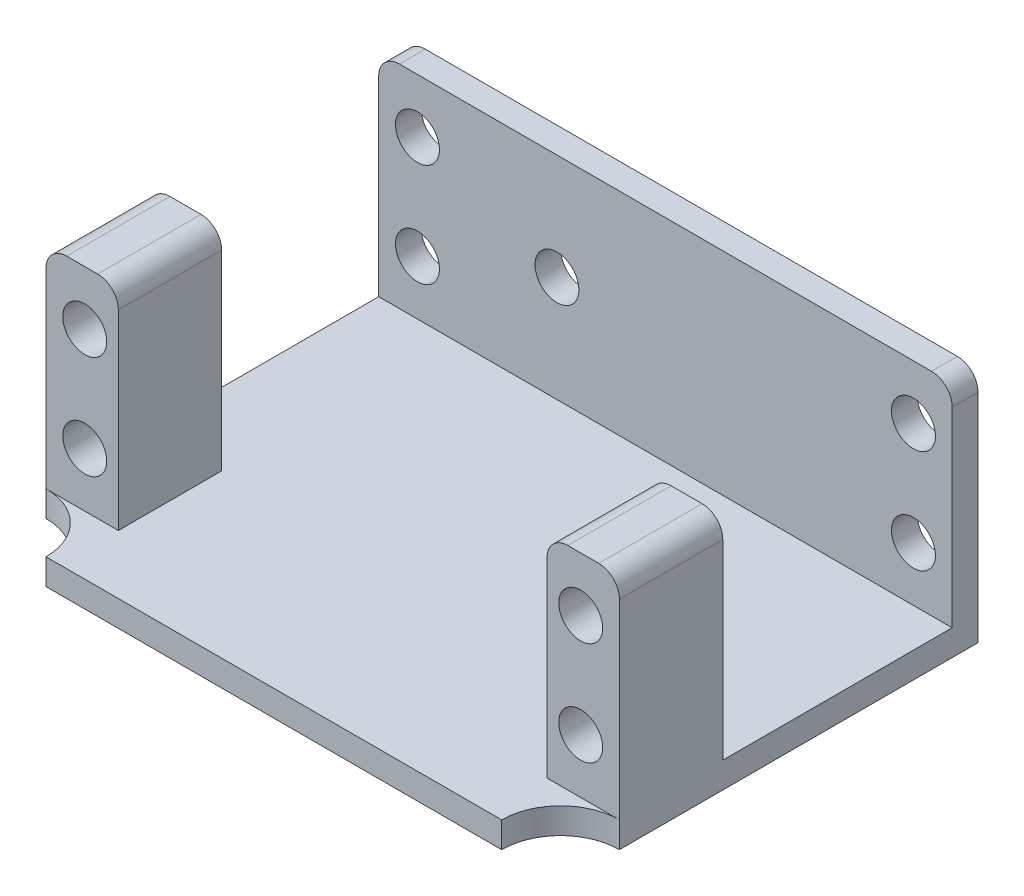
ISO-10303-21;
HEADER;
FILE_DESCRIPTION(('STEP AP214'),'2;1');
FILE_NAME('part.step','',(''),(''),'','','');
FILE_SCHEMA(('AUTOMOTIVE_DESIGN { 1 0 10303 214 1 1 1 1 }'));
ENDSEC;
DATA;
#1=APPLICATION_CONTEXT('core data for automotive mechanical design processes');
#2=APPLICATION_PROTOCOL_DEFINITION('international standard','automotive_design',2000,#1);
#3=PRODUCT_CONTEXT('',#1,'mechanical');
#4=PRODUCT('Part','Part','',(#3));
#5=PRODUCT_RELATED_PRODUCT_CATEGORY('part','',(#4));
#6=PRODUCT_DEFINITION_FORMATION('','',#4);
#7=PRODUCT_DEFINITION_CONTEXT('part definition',#1,'design');
#8=PRODUCT_DEFINITION('design','',#6,#7);
#9=PRODUCT_DEFINITION_SHAPE('','',#8);
#10=(LENGTH_UNIT() NAMED_UNIT(*) SI_UNIT(.MILLI.,.METRE.));
#11=(NAMED_UNIT(*) PLANE_ANGLE_UNIT() SI_UNIT($,.RADIAN.));
#12=(NAMED_UNIT(*) SI_UNIT($,.STERADIAN.) SOLID_ANGLE_UNIT());
#13=UNCERTAINTY_MEASURE_WITH_UNIT(LENGTH_MEASURE(1.E-05),#10,'distance_accuracy_value','');
#14=(GEOMETRIC_REPRESENTATION_CONTEXT(3) GLOBAL_UNCERTAINTY_ASSIGNED_CONTEXT((#13)) GLOBAL_UNIT_ASSIGNED_CONTEXT((#10,
#11,#12)) REPRESENTATION_CONTEXT('',''));
#15=CARTESIAN_POINT('',(0.,0.,0.));
#16=DIRECTION('',(0.,0.,1.));
#17=DIRECTION('',(1.,0.,0.));
#18=AXIS2_PLACEMENT_3D('',#15,#16,#17);
#19=CARTESIAN_POINT('',(0.,2.5,0.));
#20=DIRECTION('',(1.,0.,0.));
#21=DIRECTION('',(0.,0.,-1.));
#22=AXIS2_PLACEMENT_3D('',#19,#20,#21);
#23=PLANE('',#22);
#24=DIRECTION('',(0.,-1.,0.));
#25=VECTOR('',#24,1.);
#26=CARTESIAN_POINT('',(0.,2.5,-5.7));
#27=LINE('',#26,#25);
#28=CARTESIAN_POINT('',(0.,21.,-5.7));
#29=VERTEX_POINT('',#28);
#30=CARTESIAN_POINT('',(0.,2.5,-5.7));
#31=VERTEX_POINT('',#30);
#32=EDGE_CURVE('E361',#29,#31,#27,.T.);
#33=ORIENTED_EDGE('',*,*,#32,.F.);
#34=DIRECTION('',(0.,0.,-1.));
#35=VECTOR('',#34,1.);
#36=CARTESIAN_POINT('',(0.,21.,0.));
#37=LINE('',#36,#35);
#38=CARTESIAN_POINT('',(0.,21.,-15.7));
#39=VERTEX_POINT('',#38);
#40=EDGE_CURVE('E429',#29,#39,#37,.T.);
#41=ORIENTED_EDGE('',*,*,#40,.T.);
#42=DIRECTION('',(0.,1.,0.));
#43=VECTOR('',#42,1.);
#44=CARTESIAN_POINT('',(0.,2.5,-15.7));
#45=LINE('',#44,#43);
#46=CARTESIAN_POINT('',(0.,2.5,-15.7));
#47=VERTEX_POINT('',#46);
#48=EDGE_CURVE('E214',#47,#39,#45,.T.);
#49=ORIENTED_EDGE('',*,*,#48,.F.);
#50=DIRECTION('',(0.,0.,1.));
#51=VECTOR('',#50,1.);
#52=CARTESIAN_POINT('',(0.,2.5,0.));
#53=LINE('',#52,#51);
#54=CARTESIAN_POINT('',(0.,2.5,-37.9));
#55=VERTEX_POINT('',#54);
#56=EDGE_CURVE('E64',#55,#47,#53,.T.);
#57=ORIENTED_EDGE('',*,*,#56,.F.);
#58=DIRECTION('',(0.,-1.,0.));
#59=VECTOR('',#58,1.);
#60=CARTESIAN_POINT('',(0.,78.5562777730834,-37.9));
#61=LINE('',#60,#59);
#62=CARTESIAN_POINT('',(0.,21.,-37.9));
#63=VERTEX_POINT('',#62);
#64=EDGE_CURVE('E322',#63,#55,#61,.T.);
#65=ORIENTED_EDGE('',*,*,#64,.F.);
#66=DIRECTION('',(0.,0.,-1.));
#67=VECTOR('',#66,1.);
#68=CARTESIAN_POINT('',(0.,21.,0.));
#69=LINE('',#68,#67);
#70=CARTESIAN_POINT('',(0.,21.,-40.4));
#71=VERTEX_POINT('',#70);
#72=EDGE_CURVE('E425',#63,#71,#69,.T.);
#73=ORIENTED_EDGE('',*,*,#72,.T.);
#74=DIRECTION('',(0.,-1.,0.));
#75=VECTOR('',#74,1.);
#76=CARTESIAN_POINT('',(0.,78.5562777730834,-40.4));
#77=LINE('',#76,#75);
#78=CARTESIAN_POINT('',(0.,0.,-40.4));
#79=VERTEX_POINT('',#78);
#80=EDGE_CURVE('E312',#71,#79,#77,.T.);
#81=ORIENTED_EDGE('',*,*,#80,.T.);
#82=DIRECTION('',(0.,0.,1.));
#83=VECTOR('',#82,1.);
#84=CARTESIAN_POINT('',(0.,0.,0.));
#85=LINE('',#84,#83);
#86=CARTESIAN_POINT('',(0.,0.,-5.7));
#87=VERTEX_POINT('',#86);
#88=EDGE_CURVE('E377',#79,#87,#85,.T.);
#89=ORIENTED_EDGE('',*,*,#88,.T.);
#90=DIRECTION('',(0.,1.,0.));
#91=VECTOR('',#90,1.);
#92=CARTESIAN_POINT('',(0.,0.,-5.7));
#93=LINE('',#92,#91);
#94=EDGE_CURVE('E298',#87,#31,#93,.T.);
#95=ORIENTED_EDGE('',*,*,#94,.T.);
#96=EDGE_LOOP('',(#33,#41,#49,#57,#65,#73,#81,#89,#95));
#97=FACE_BOUND('',#96,.T.);
#98=ADVANCED_FACE('F40',(#97),#23,.F.);
#99=CARTESIAN_POINT('',(0.,2.5,0.));
#100=DIRECTION('',(0.,0.,-1.));
#101=DIRECTION('',(-1.,0.,0.));
#102=AXIS2_PLACEMENT_3D('',#99,#100,#101);
#103=PLANE('',#102);
#104=DIRECTION('',(1.,0.,0.));
#105=VECTOR('',#104,1.);
#106=CARTESIAN_POINT('',(0.,2.5,0.));
#107=LINE('',#106,#105);
#108=CARTESIAN_POINT('',(5.7,2.5,0.));
#109=VERTEX_POINT('',#108);
#110=CARTESIAN_POINT('',(49.8,2.5,0.));
#111=VERTEX_POINT('',#110);
#112=EDGE_CURVE('E380',#109,#111,#107,.T.);
#113=ORIENTED_EDGE('',*,*,#112,.F.);
#114=DIRECTION('',(0.,1.,0.));
#115=VECTOR('',#114,1.);
#116=CARTESIAN_POINT('',(5.7,0.,0.));
#117=LINE('',#116,#115);
#118=CARTESIAN_POINT('',(5.7,0.,0.));
#119=VERTEX_POINT('',#118);
#120=EDGE_CURVE('E294',#109,#119,#117,.F.);
#121=ORIENTED_EDGE('',*,*,#120,.T.);
#122=DIRECTION('',(1.,0.,0.));
#123=VECTOR('',#122,1.);
#124=CARTESIAN_POINT('',(0.,0.,0.));
#125=LINE('',#124,#123);
#126=CARTESIAN_POINT('',(49.8,0.,0.));
#127=VERTEX_POINT('',#126);
#128=EDGE_CURVE('E393',#119,#127,#125,.T.);
#129=ORIENTED_EDGE('',*,*,#128,.T.);
#130=DIRECTION('',(0.,1.,0.));
#131=VECTOR('',#130,1.);
#132=CARTESIAN_POINT('',(49.8,0.,0.));
#133=LINE('',#132,#131);
#134=EDGE_CURVE('E290',#127,#111,#133,.T.);
#135=ORIENTED_EDGE('',*,*,#134,.T.);
#136=EDGE_LOOP('',(#113,#121,#129,#135));
#137=FACE_BOUND('',#136,.T.);
#138=ADVANCED_FACE('F482',(#137),#103,.F.);
#139=CARTESIAN_POINT('',(55.5,2.5,0.));
#140=DIRECTION('',(-1.,0.,0.));
#141=DIRECTION('',(0.,0.,1.));
#142=AXIS2_PLACEMENT_3D('',#139,#140,#141);
#143=PLANE('',#142);
#144=DIRECTION('',(0.,0.,-1.));
#145=VECTOR('',#144,1.);
#146=CARTESIAN_POINT('',(55.5,2.5,0.));
#147=LINE('',#146,#145);
#148=CARTESIAN_POINT('',(55.5,2.5,-15.7));
#149=VERTEX_POINT('',#148);
#150=CARTESIAN_POINT('',(55.5,2.5,-37.9));
#151=VERTEX_POINT('',#150);
#152=EDGE_CURVE('E385',#149,#151,#147,.T.);
#153=ORIENTED_EDGE('',*,*,#152,.F.);
#154=DIRECTION('',(0.,-1.,0.));
#155=VECTOR('',#154,1.);
#156=CARTESIAN_POINT('',(55.5,21.,-15.7));
#157=LINE('',#156,#155);
#158=CARTESIAN_POINT('',(55.5,21.,-15.7));
#159=VERTEX_POINT('',#158);
#160=EDGE_CURVE('E263',#159,#149,#157,.T.);
#161=ORIENTED_EDGE('',*,*,#160,.F.);
#162=DIRECTION('',(0.,0.,-1.));
#163=VECTOR('',#162,1.);
#164=CARTESIAN_POINT('',(55.5,21.,0.));
#165=LINE('',#164,#163);
#166=CARTESIAN_POINT('',(55.5,21.,-5.7));
#167=VERTEX_POINT('',#166);
#168=EDGE_CURVE('E436',#159,#167,#165,.F.);
#169=ORIENTED_EDGE('',*,*,#168,.T.);
#170=DIRECTION('',(0.,1.,0.));
#171=VECTOR('',#170,1.);
#172=CARTESIAN_POINT('',(55.5,2.5,-5.7));
#173=LINE('',#172,#171);
#174=CARTESIAN_POINT('',(55.5,2.5,-5.7));
#175=VERTEX_POINT('',#174);
#176=EDGE_CURVE('E343',#175,#167,#173,.T.);
#177=ORIENTED_EDGE('',*,*,#176,.F.);
#178=DIRECTION('',(0.,1.,0.));
#179=VECTOR('',#178,1.);
#180=CARTESIAN_POINT('',(55.5,0.,-5.7));
#181=LINE('',#180,#179);
#182=CARTESIAN_POINT('',(55.5,0.,-5.7));
#183=VERTEX_POINT('',#182);
#184=EDGE_CURVE('E275',#175,#183,#181,.F.);
#185=ORIENTED_EDGE('',*,*,#184,.T.);
#186=DIRECTION('',(0.,0.,-1.));
#187=VECTOR('',#186,1.);
#188=CARTESIAN_POINT('',(55.5,0.,0.));
#189=LINE('',#188,#187);
#190=CARTESIAN_POINT('',(55.5,0.,-40.4));
#191=VERTEX_POINT('',#190);
#192=EDGE_CURVE('E381',#183,#191,#189,.T.);
#193=ORIENTED_EDGE('',*,*,#192,.T.);
#194=DIRECTION('',(0.,-1.,0.));
#195=VECTOR('',#194,1.);
#196=CARTESIAN_POINT('',(55.5,78.5562777730834,-40.4));
#197=LINE('',#196,#195);
#198=CARTESIAN_POINT('',(55.5,21.,-40.4));
#199=VERTEX_POINT('',#198);
#200=EDGE_CURVE('E315',#199,#191,#197,.T.);
#201=ORIENTED_EDGE('',*,*,#200,.F.);
#202=DIRECTION('',(0.,0.,1.));
#203=VECTOR('',#202,1.);
#204=CARTESIAN_POINT('',(55.5,21.,0.));
#205=LINE('',#204,#203);
#206=CARTESIAN_POINT('',(55.5,21.,-37.9));
#207=VERTEX_POINT('',#206);
#208=EDGE_CURVE('E432',#199,#207,#205,.T.);
#209=ORIENTED_EDGE('',*,*,#208,.T.);
#210=DIRECTION('',(0.,-1.,0.));
#211=VECTOR('',#210,1.);
#212=CARTESIAN_POINT('',(55.5,78.5562777730834,-37.9));
#213=LINE('',#212,#211);
#214=EDGE_CURVE('E318',#207,#151,#213,.T.);
#215=ORIENTED_EDGE('',*,*,#214,.T.);
#216=EDGE_LOOP('',(#153,#161,#169,#177,#185,#193,#201,#209,#215));
#217=FACE_BOUND('',#216,.T.);
#218=ADVANCED_FACE('F494',(#217),#143,.F.);
#219=CARTESIAN_POINT('',(0.,2.5,0.));
#220=DIRECTION('',(0.,-1.,0.));
#221=DIRECTION('',(0.,0.,-1.));
#222=AXIS2_PLACEMENT_3D('',#219,#220,#221);
#223=PLANE('',#222);
#224=ORIENTED_EDGE('',*,*,#56,.T.);
#225=DIRECTION('',(-1.,0.,0.));
#226=VECTOR('',#225,1.);
#227=CARTESIAN_POINT('',(7.,2.5,-15.7));
#228=LINE('',#227,#226);
#229=CARTESIAN_POINT('',(7.,2.5,-15.7));
#230=VERTEX_POINT('',#229);
#231=EDGE_CURVE('E230',#230,#47,#228,.T.);
#232=ORIENTED_EDGE('',*,*,#231,.F.);
#233=DIRECTION('',(0.,0.,-1.));
#234=VECTOR('',#233,1.);
#235=CARTESIAN_POINT('',(7.,2.5,-5.7));
#236=LINE('',#235,#234);
#237=CARTESIAN_POINT('',(7.,2.5,-5.7));
#238=VERTEX_POINT('',#237);
#239=EDGE_CURVE('E57',#238,#230,#236,.T.);
#240=ORIENTED_EDGE('',*,*,#239,.F.);
#241=DIRECTION('',(1.,0.,0.));
#242=VECTOR('',#241,1.);
#243=CARTESIAN_POINT('',(0.,2.5,-5.7));
#244=LINE('',#243,#242);
#245=EDGE_CURVE('E364',#31,#238,#244,.T.);
#246=ORIENTED_EDGE('',*,*,#245,.F.);
#247=CARTESIAN_POINT('',(0.,2.5,0.));
#248=DIRECTION('',(0.,1.,0.));
#249=DIRECTION('',(0.,0.,1.));
#250=AXIS2_PLACEMENT_3D('',#247,#248,#249);
#251=CIRCLE('',#250,5.7);
#252=EDGE_CURVE('E276',#109,#31,#251,.T.);
#253=ORIENTED_EDGE('',*,*,#252,.F.);
#254=ORIENTED_EDGE('',*,*,#112,.T.);
#255=CARTESIAN_POINT('',(55.5,2.5,0.));
#256=DIRECTION('',(0.,1.,0.));
#257=DIRECTION('',(0.,0.,1.));
#258=AXIS2_PLACEMENT_3D('',#255,#256,#257);
#259=CIRCLE('',#258,5.7);
#260=EDGE_CURVE('E284',#175,#111,#259,.T.);
#261=ORIENTED_EDGE('',*,*,#260,.F.);
#262=DIRECTION('',(1.,0.,0.));
#263=VECTOR('',#262,1.);
#264=CARTESIAN_POINT('',(55.5,2.5,-5.7));
#265=LINE('',#264,#263);
#266=CARTESIAN_POINT('',(48.5,2.5,-5.7));
#267=VERTEX_POINT('',#266);
#268=EDGE_CURVE('E354',#267,#175,#265,.T.);
#269=ORIENTED_EDGE('',*,*,#268,.F.);
#270=DIRECTION('',(0.,0.,-1.));
#271=VECTOR('',#270,1.);
#272=CARTESIAN_POINT('',(48.5,2.5,-5.7));
#273=LINE('',#272,#271);
#274=CARTESIAN_POINT('',(48.5,2.5,-15.7));
#275=VERTEX_POINT('',#274);
#276=EDGE_CURVE('E358',#267,#275,#273,.T.);
#277=ORIENTED_EDGE('',*,*,#276,.T.);
#278=DIRECTION('',(-1.,0.,0.));
#279=VECTOR('',#278,1.);
#280=CARTESIAN_POINT('',(55.5,2.5,-15.7));
#281=LINE('',#280,#279);
#282=EDGE_CURVE('E243',#149,#275,#281,.T.);
#283=ORIENTED_EDGE('',*,*,#282,.F.);
#284=ORIENTED_EDGE('',*,*,#152,.T.);
#285=DIRECTION('',(-1.,0.,0.));
#286=VECTOR('',#285,1.);
#287=CARTESIAN_POINT('',(0.,2.5,-37.9));
#288=LINE('',#287,#286);
#289=EDGE_CURVE('E198',#151,#55,#288,.T.);
#290=ORIENTED_EDGE('',*,*,#289,.T.);
#291=EDGE_LOOP('',(#224,#232,#240,#246,#253,#254,#261,#269,#277,#283,#284,#290));
#292=FACE_BOUND('',#291,.T.);
#293=ADVANCED_FACE('F479',(#292),#223,.F.);
#294=CARTESIAN_POINT('',(0.,0.,0.));
#295=DIRECTION('',(0.,-1.,0.));
#296=DIRECTION('',(0.,0.,-1.));
#297=AXIS2_PLACEMENT_3D('',#294,#295,#296);
#298=PLANE('',#297);
#299=CARTESIAN_POINT('',(0.,0.,0.));
#300=DIRECTION('',(0.,1.,0.));
#301=DIRECTION('',(0.,0.,1.));
#302=AXIS2_PLACEMENT_3D('',#299,#300,#301);
#303=CIRCLE('',#302,5.7);
#304=EDGE_CURVE('E271',#119,#87,#303,.T.);
#305=ORIENTED_EDGE('',*,*,#304,.T.);
#306=ORIENTED_EDGE('',*,*,#88,.F.);
#307=DIRECTION('',(-1.,0.,0.));
#308=VECTOR('',#307,1.);
#309=CARTESIAN_POINT('',(0.,0.,-40.4));
#310=LINE('',#309,#308);
#311=EDGE_CURVE('E302',#191,#79,#310,.T.);
#312=ORIENTED_EDGE('',*,*,#311,.F.);
#313=ORIENTED_EDGE('',*,*,#192,.F.);
#314=CARTESIAN_POINT('',(55.5,0.,0.));
#315=DIRECTION('',(0.,1.,0.));
#316=DIRECTION('',(0.,0.,1.));
#317=AXIS2_PLACEMENT_3D('',#314,#315,#316);
#318=CIRCLE('',#317,5.7);
#319=EDGE_CURVE('E280',#183,#127,#318,.T.);
#320=ORIENTED_EDGE('',*,*,#319,.T.);
#321=ORIENTED_EDGE('',*,*,#128,.F.);
#322=EDGE_LOOP('',(#305,#306,#312,#313,#320,#321));
#323=FACE_BOUND('',#322,.T.);
#324=ADVANCED_FACE('F488',(#323),#298,.T.);
#325=CARTESIAN_POINT('',(7.,2.5,-5.7));
#326=DIRECTION('',(-1.,0.,0.));
#327=DIRECTION('',(0.,0.,1.));
#328=AXIS2_PLACEMENT_3D('',#325,#326,#327);
#329=PLANE('',#328);
#330=ORIENTED_EDGE('',*,*,#239,.T.);
#331=DIRECTION('',(0.,-1.,0.));
#332=VECTOR('',#331,1.);
#333=CARTESIAN_POINT('',(7.,21.,-15.7));
#334=LINE('',#333,#332);
#335=CARTESIAN_POINT('',(7.,21.,-15.7));
#336=VERTEX_POINT('',#335);
#337=EDGE_CURVE('E226',#336,#230,#334,.T.);
#338=ORIENTED_EDGE('',*,*,#337,.F.);
#339=DIRECTION('',(0.,0.,-1.));
#340=VECTOR('',#339,1.);
#341=CARTESIAN_POINT('',(7.,21.,-5.7));
#342=LINE('',#341,#340);
#343=CARTESIAN_POINT('',(7.,21.,-5.7));
#344=VERTEX_POINT('',#343);
#345=EDGE_CURVE('E402',#336,#344,#342,.F.);
#346=ORIENTED_EDGE('',*,*,#345,.T.);
#347=DIRECTION('',(0.,1.,0.));
#348=VECTOR('',#347,1.);
#349=CARTESIAN_POINT('',(7.,2.5,-5.7));
#350=LINE('',#349,#348);
#351=EDGE_CURVE('E368',#238,#344,#350,.T.);
#352=ORIENTED_EDGE('',*,*,#351,.F.);
#353=EDGE_LOOP('',(#330,#338,#346,#352));
#354=FACE_BOUND('',#353,.T.);
#355=ADVANCED_FACE('F672',(#354),#329,.F.);
#356=CARTESIAN_POINT('',(0.,23.,-5.7));
#357=DIRECTION('',(0.,-1.,0.));
#358=DIRECTION('',(0.,0.,-1.));
#359=AXIS2_PLACEMENT_3D('',#356,#357,#358);
#360=PLANE('',#359);
#361=DIRECTION('',(-1.,0.,0.));
#362=VECTOR('',#361,1.);
#363=CARTESIAN_POINT('',(0.,23.,-5.7));
#364=LINE('',#363,#362);
#365=CARTESIAN_POINT('',(5.,23.,-5.7));
#366=VERTEX_POINT('',#365);
#367=CARTESIAN_POINT('',(2.,23.,-5.7));
#368=VERTEX_POINT('',#367);
#369=EDGE_CURVE('E372',#366,#368,#364,.T.);
#370=ORIENTED_EDGE('',*,*,#369,.F.);
#371=DIRECTION('',(0.,0.,-1.));
#372=VECTOR('',#371,1.);
#373=CARTESIAN_POINT('',(5.,23.,-5.7));
#374=LINE('',#373,#372);
#375=CARTESIAN_POINT('',(5.,23.,-15.7));
#376=VERTEX_POINT('',#375);
#377=EDGE_CURVE('E197',#366,#376,#374,.T.);
#378=ORIENTED_EDGE('',*,*,#377,.T.);
#379=DIRECTION('',(1.,0.,0.));
#380=VECTOR('',#379,1.);
#381=CARTESIAN_POINT('',(2.,23.,-15.7));
#382=LINE('',#381,#380);
#383=CARTESIAN_POINT('',(2.,23.,-15.7));
#384=VERTEX_POINT('',#383);
#385=EDGE_CURVE('E201',#384,#376,#382,.T.);
#386=ORIENTED_EDGE('',*,*,#385,.F.);
#387=DIRECTION('',(0.,0.,-1.));
#388=VECTOR('',#387,1.);
#389=CARTESIAN_POINT('',(2.,23.,-5.7));
#390=LINE('',#389,#388);
#391=EDGE_CURVE('E186',#384,#368,#390,.F.);
#392=ORIENTED_EDGE('',*,*,#391,.T.);
#393=EDGE_LOOP('',(#370,#378,#386,#392));
#394=FACE_BOUND('',#393,.T.);
#395=ADVANCED_FACE('F202',(#394),#360,.F.);
#396=CARTESIAN_POINT('',(0.,0.,-5.7));
#397=DIRECTION('',(0.,0.,-1.));
#398=DIRECTION('',(-1.,0.,0.));
#399=AXIS2_PLACEMENT_3D('',#396,#397,#398);
#400=PLANE('',#399);
#401=CARTESIAN_POINT('',(3.75,7.75,-5.7));
#402=DIRECTION('',(0.,0.,1.));
#403=DIRECTION('',(-1.,0.,0.));
#404=AXIS2_PLACEMENT_3D('',#401,#402,#403);
#405=CIRCLE('',#404,2.125);
#406=CARTESIAN_POINT('',(1.625,7.75,-5.7));
#407=VERTEX_POINT('',#406);
#408=EDGE_CURVE('E328',#407,#407,#405,.T.);
#409=ORIENTED_EDGE('',*,*,#408,.F.);
#410=EDGE_LOOP('',(#409));
#411=FACE_BOUND('',#410,.T.);
#412=CARTESIAN_POINT('',(3.75,17.75,-5.7));
#413=DIRECTION('',(0.,0.,1.));
#414=DIRECTION('',(1.,0.,0.));
#415=AXIS2_PLACEMENT_3D('',#412,#413,#414);
#416=CIRCLE('',#415,2.125);
#417=CARTESIAN_POINT('',(5.875,17.75,-5.7));
#418=VERTEX_POINT('',#417);
#419=EDGE_CURVE('E332',#418,#418,#416,.T.);
#420=ORIENTED_EDGE('',*,*,#419,.F.);
#421=EDGE_LOOP('',(#420));
#422=FACE_BOUND('',#421,.T.);
#423=ORIENTED_EDGE('',*,*,#351,.T.);
#424=CARTESIAN_POINT('',(5.,21.,-5.7));
#425=DIRECTION('',(0.,0.,-1.));
#426=DIRECTION('',(-1.,0.,0.));
#427=AXIS2_PLACEMENT_3D('',#424,#425,#426);
#428=CIRCLE('',#427,2.);
#429=EDGE_CURVE('E407',#344,#366,#428,.F.);
#430=ORIENTED_EDGE('',*,*,#429,.T.);
#431=ORIENTED_EDGE('',*,*,#369,.T.);
#432=CARTESIAN_POINT('',(2.,21.,-5.7));
#433=DIRECTION('',(0.,0.,-1.));
#434=DIRECTION('',(-1.,0.,0.));
#435=AXIS2_PLACEMENT_3D('',#432,#433,#434);
#436=CIRCLE('',#435,2.);
#437=EDGE_CURVE('E192',#368,#29,#436,.F.);
#438=ORIENTED_EDGE('',*,*,#437,.T.);
#439=ORIENTED_EDGE('',*,*,#32,.T.);
#440=ORIENTED_EDGE('',*,*,#245,.T.);
#441=EDGE_LOOP('',(#423,#430,#431,#438,#439,#440));
#442=FACE_BOUND('',#441,.T.);
#443=ADVANCED_FACE('F474',(#411,#422,#442),#400,.F.);
#444=CARTESIAN_POINT('',(55.5,23.,-5.7));
#445=DIRECTION('',(0.,-1.,0.));
#446=DIRECTION('',(0.,0.,-1.));
#447=AXIS2_PLACEMENT_3D('',#444,#445,#446);
#448=PLANE('',#447);
#449=DIRECTION('',(0.,0.,-1.));
#450=VECTOR('',#449,1.);
#451=CARTESIAN_POINT('',(53.5,23.,-5.7));
#452=LINE('',#451,#450);
#453=CARTESIAN_POINT('',(53.5,23.,-5.7));
#454=VERTEX_POINT('',#453);
#455=CARTESIAN_POINT('',(53.5,23.,-15.7));
#456=VERTEX_POINT('',#455);
#457=EDGE_CURVE('E413',#454,#456,#452,.T.);
#458=ORIENTED_EDGE('',*,*,#457,.T.);
#459=DIRECTION('',(1.,0.,0.));
#460=VECTOR('',#459,1.);
#461=CARTESIAN_POINT('',(50.5,23.,-15.7));
#462=LINE('',#461,#460);
#463=CARTESIAN_POINT('',(50.5,23.,-15.7));
#464=VERTEX_POINT('',#463);
#465=EDGE_CURVE('E255',#464,#456,#462,.T.);
#466=ORIENTED_EDGE('',*,*,#465,.F.);
#467=DIRECTION('',(0.,0.,-1.));
#468=VECTOR('',#467,1.);
#469=CARTESIAN_POINT('',(50.5,23.,-5.7));
#470=LINE('',#469,#468);
#471=CARTESIAN_POINT('',(50.5,23.,-5.7));
#472=VERTEX_POINT('',#471);
#473=EDGE_CURVE('E416',#464,#472,#470,.F.);
#474=ORIENTED_EDGE('',*,*,#473,.T.);
#475=DIRECTION('',(-1.,0.,0.));
#476=VECTOR('',#475,1.);
#477=CARTESIAN_POINT('',(55.5,23.,-5.7));
#478=LINE('',#477,#476);
#479=EDGE_CURVE('E347',#454,#472,#478,.T.);
#480=ORIENTED_EDGE('',*,*,#479,.F.);
#481=EDGE_LOOP('',(#458,#466,#474,#480));
#482=FACE_BOUND('',#481,.T.);
#483=ADVANCED_FACE('F517',(#482),#448,.F.);
#484=CARTESIAN_POINT('',(48.5,2.5,-5.7));
#485=DIRECTION('',(1.,0.,0.));
#486=DIRECTION('',(0.,0.,-1.));
#487=AXIS2_PLACEMENT_3D('',#484,#485,#486);
#488=PLANE('',#487);
#489=DIRECTION('',(0.,-1.,0.));
#490=VECTOR('',#489,1.);
#491=CARTESIAN_POINT('',(48.5,2.5,-5.7));
#492=LINE('',#491,#490);
#493=CARTESIAN_POINT('',(48.5,21.,-5.7));
#494=VERTEX_POINT('',#493);
#495=EDGE_CURVE('E351',#494,#267,#492,.T.);
#496=ORIENTED_EDGE('',*,*,#495,.F.);
#497=DIRECTION('',(0.,0.,-1.));
#498=VECTOR('',#497,1.);
#499=CARTESIAN_POINT('',(48.5,21.,-5.7));
#500=LINE('',#499,#498);
#501=CARTESIAN_POINT('',(48.5,21.,-15.7));
#502=VERTEX_POINT('',#501);
#503=EDGE_CURVE('E410',#494,#502,#500,.T.);
#504=ORIENTED_EDGE('',*,*,#503,.T.);
#505=DIRECTION('',(0.,1.,0.));
#506=VECTOR('',#505,1.);
#507=CARTESIAN_POINT('',(48.5,2.5,-15.7));
#508=LINE('',#507,#506);
#509=EDGE_CURVE('E247',#275,#502,#508,.T.);
#510=ORIENTED_EDGE('',*,*,#509,.F.);
#511=ORIENTED_EDGE('',*,*,#276,.F.);
#512=EDGE_LOOP('',(#496,#504,#510,#511));
#513=FACE_BOUND('',#512,.T.);
#514=ADVANCED_FACE('F506',(#513),#488,.F.);
#515=CARTESIAN_POINT('',(0.,0.,-5.7));
#516=DIRECTION('',(0.,0.,1.));
#517=DIRECTION('',(1.,0.,0.));
#518=AXIS2_PLACEMENT_3D('',#515,#516,#517);
#519=PLANE('',#518);
#520=CARTESIAN_POINT('',(51.75,17.75,-5.7));
#521=DIRECTION('',(0.,0.,1.));
#522=DIRECTION('',(-1.,0.,0.));
#523=AXIS2_PLACEMENT_3D('',#520,#521,#522);
#524=CIRCLE('',#523,2.125);
#525=CARTESIAN_POINT('',(49.625,17.75,-5.7));
#526=VERTEX_POINT('',#525);
#527=EDGE_CURVE('E307',#526,#526,#524,.T.);
#528=ORIENTED_EDGE('',*,*,#527,.F.);
#529=EDGE_LOOP('',(#528));
#530=FACE_BOUND('',#529,.T.);
#531=CARTESIAN_POINT('',(51.75,7.75,-5.7));
#532=DIRECTION('',(0.,0.,1.));
#533=DIRECTION('',(1.,0.,0.));
#534=AXIS2_PLACEMENT_3D('',#531,#532,#533);
#535=CIRCLE('',#534,2.125);
#536=CARTESIAN_POINT('',(53.875,7.75,-5.7));
#537=VERTEX_POINT('',#536);
#538=EDGE_CURVE('E333',#537,#537,#535,.T.);
#539=ORIENTED_EDGE('',*,*,#538,.F.);
#540=EDGE_LOOP('',(#539));
#541=FACE_BOUND('',#540,.T.);
#542=ORIENTED_EDGE('',*,*,#479,.T.);
#543=CARTESIAN_POINT('',(50.5,21.,-5.7));
#544=DIRECTION('',(0.,0.,1.));
#545=DIRECTION('',(1.,0.,0.));
#546=AXIS2_PLACEMENT_3D('',#543,#544,#545);
#547=CIRCLE('',#546,2.);
#548=EDGE_CURVE('E422',#472,#494,#547,.T.);
#549=ORIENTED_EDGE('',*,*,#548,.T.);
#550=ORIENTED_EDGE('',*,*,#495,.T.);
#551=ORIENTED_EDGE('',*,*,#268,.T.);
#552=ORIENTED_EDGE('',*,*,#176,.T.);
#553=CARTESIAN_POINT('',(53.5,21.,-5.7));
#554=DIRECTION('',(0.,0.,1.));
#555=DIRECTION('',(1.,0.,0.));
#556=AXIS2_PLACEMENT_3D('',#553,#554,#555);
#557=CIRCLE('',#556,2.);
#558=EDGE_CURVE('E419',#167,#454,#557,.T.);
#559=ORIENTED_EDGE('',*,*,#558,.T.);
#560=EDGE_LOOP('',(#542,#549,#550,#551,#552,#559));
#561=FACE_BOUND('',#560,.T.);
#562=ADVANCED_FACE('F500',(#530,#541,#561),#519,.T.);
#563=CARTESIAN_POINT('',(51.75,7.75,-8.2));
#564=DIRECTION('',(0.,0.,1.));
#565=DIRECTION('',(1.,0.,0.));
#566=AXIS2_PLACEMENT_3D('',#563,#564,#565);
#567=CYLINDRICAL_SURFACE('',#566,2.125);
#568=ORIENTED_EDGE('',*,*,#538,.T.);
#569=EDGE_LOOP('',(#568));
#570=FACE_BOUND('',#569,.T.);
#571=CARTESIAN_POINT('',(51.75,7.75,-15.7));
#572=DIRECTION('',(0.,0.,-1.));
#573=DIRECTION('',(-1.,0.,0.));
#574=AXIS2_PLACEMENT_3D('',#571,#572,#573);
#575=CIRCLE('',#574,2.125);
#576=CARTESIAN_POINT('',(49.625,7.75,-15.7));
#577=VERTEX_POINT('',#576);
#578=EDGE_CURVE('E235',#577,#577,#575,.T.);
#579=ORIENTED_EDGE('',*,*,#578,.T.);
#580=EDGE_LOOP('',(#579));
#581=FACE_BOUND('',#580,.T.);
#582=ADVANCED_FACE('F649',(#570,#581),#567,.F.);
#583=CARTESIAN_POINT('',(51.75,17.75,-8.2));
#584=DIRECTION('',(0.,0.,1.));
#585=DIRECTION('',(1.,0.,0.));
#586=AXIS2_PLACEMENT_3D('',#583,#584,#585);
#587=CYLINDRICAL_SURFACE('',#586,2.125);
#588=ORIENTED_EDGE('',*,*,#527,.T.);
#589=EDGE_LOOP('',(#588));
#590=FACE_BOUND('',#589,.T.);
#591=CARTESIAN_POINT('',(51.75,17.75,-15.7));
#592=DIRECTION('',(0.,0.,-1.));
#593=DIRECTION('',(-1.,0.,0.));
#594=AXIS2_PLACEMENT_3D('',#591,#592,#593);
#595=CIRCLE('',#594,2.125);
#596=CARTESIAN_POINT('',(49.625,17.75,-15.7));
#597=VERTEX_POINT('',#596);
#598=EDGE_CURVE('E239',#597,#597,#595,.T.);
#599=ORIENTED_EDGE('',*,*,#598,.T.);
#600=EDGE_LOOP('',(#599));
#601=FACE_BOUND('',#600,.T.);
#602=ADVANCED_FACE('F652',(#590,#601),#587,.F.);
#603=CARTESIAN_POINT('',(3.75,17.75,-8.2));
#604=DIRECTION('',(0.,0.,1.));
#605=DIRECTION('',(1.,0.,0.));
#606=AXIS2_PLACEMENT_3D('',#603,#604,#605);
#607=CYLINDRICAL_SURFACE('',#606,2.125);
#608=ORIENTED_EDGE('',*,*,#419,.T.);
#609=EDGE_LOOP('',(#608));
#610=FACE_BOUND('',#609,.T.);
#611=CARTESIAN_POINT('',(3.75,17.75,-15.7));
#612=DIRECTION('',(0.,0.,-1.));
#613=DIRECTION('',(-1.,0.,0.));
#614=AXIS2_PLACEMENT_3D('',#611,#612,#613);
#615=CIRCLE('',#614,2.125);
#616=CARTESIAN_POINT('',(1.625,17.75,-15.7));
#617=VERTEX_POINT('',#616);
#618=EDGE_CURVE('E216',#617,#617,#615,.T.);
#619=ORIENTED_EDGE('',*,*,#618,.T.);
#620=EDGE_LOOP('',(#619));
#621=FACE_BOUND('',#620,.T.);
#622=ADVANCED_FACE('F647',(#610,#621),#607,.F.);
#623=CARTESIAN_POINT('',(3.75,7.75,-8.2));
#624=DIRECTION('',(0.,0.,1.));
#625=DIRECTION('',(1.,0.,0.));
#626=AXIS2_PLACEMENT_3D('',#623,#624,#625);
#627=CYLINDRICAL_SURFACE('',#626,2.125);
#628=ORIENTED_EDGE('',*,*,#408,.T.);
#629=EDGE_LOOP('',(#628));
#630=FACE_BOUND('',#629,.T.);
#631=CARTESIAN_POINT('',(3.75,7.75,-15.7));
#632=DIRECTION('',(0.,0.,-1.));
#633=DIRECTION('',(-1.,0.,0.));
#634=AXIS2_PLACEMENT_3D('',#631,#632,#633);
#635=CIRCLE('',#634,2.125);
#636=CARTESIAN_POINT('',(1.625,7.75,-15.7));
#637=VERTEX_POINT('',#636);
#638=EDGE_CURVE('E220',#637,#637,#635,.T.);
#639=ORIENTED_EDGE('',*,*,#638,.T.);
#640=EDGE_LOOP('',(#639));
#641=FACE_BOUND('',#640,.T.);
#642=ADVANCED_FACE('F586',(#630,#641),#627,.F.);
#643=CARTESIAN_POINT('',(0.,78.5562777730834,-40.4));
#644=DIRECTION('',(0.,0.,1.));
#645=DIRECTION('',(1.,0.,0.));
#646=AXIS2_PLACEMENT_3D('',#643,#644,#645);
#647=PLANE('',#646);
#648=CARTESIAN_POINT('',(3.75,7.75,-40.4));
#649=DIRECTION('',(0.,0.,1.));
#650=DIRECTION('',(1.,0.,0.));
#651=AXIS2_PLACEMENT_3D('',#648,#649,#650);
#652=CIRCLE('',#651,2.125);
#653=CARTESIAN_POINT('',(5.875,7.75,-40.4));
#654=VERTEX_POINT('',#653);
#655=EDGE_CURVE('E903',#654,#654,#652,.T.);
#656=ORIENTED_EDGE('',*,*,#655,.T.);
#657=EDGE_LOOP('',(#656));
#658=FACE_BOUND('',#657,.T.);
#659=CARTESIAN_POINT('',(51.75,17.75,-40.4));
#660=DIRECTION('',(0.,0.,1.));
#661=DIRECTION('',(1.,0.,0.));
#662=AXIS2_PLACEMENT_3D('',#659,#660,#661);
#663=CIRCLE('',#662,2.125);
#664=CARTESIAN_POINT('',(53.875,17.75,-40.4));
#665=VERTEX_POINT('',#664);
#666=EDGE_CURVE('E904',#665,#665,#663,.T.);
#667=ORIENTED_EDGE('',*,*,#666,.T.);
#668=EDGE_LOOP('',(#667));
#669=FACE_BOUND('',#668,.T.);
#670=CARTESIAN_POINT('',(51.75,7.75,-40.4));
#671=DIRECTION('',(0.,0.,1.));
#672=DIRECTION('',(1.,0.,0.));
#673=AXIS2_PLACEMENT_3D('',#670,#671,#672);
#674=CIRCLE('',#673,2.125);
#675=CARTESIAN_POINT('',(53.875,7.75,-40.4));
#676=VERTEX_POINT('',#675);
#677=EDGE_CURVE('E908',#676,#676,#674,.T.);
#678=ORIENTED_EDGE('',*,*,#677,.T.);
#679=EDGE_LOOP('',(#678));
#680=FACE_BOUND('',#679,.T.);
#681=CARTESIAN_POINT('',(3.75,17.75,-40.4));
#682=DIRECTION('',(0.,0.,1.));
#683=DIRECTION('',(1.,0.,0.));
#684=AXIS2_PLACEMENT_3D('',#681,#682,#683);
#685=CIRCLE('',#684,2.125);
#686=CARTESIAN_POINT('',(5.875,17.75,-40.4));
#687=VERTEX_POINT('',#686);
#688=EDGE_CURVE('E899',#687,#687,#685,.T.);
#689=ORIENTED_EDGE('',*,*,#688,.T.);
#690=EDGE_LOOP('',(#689));
#691=FACE_BOUND('',#690,.T.);
#692=CARTESIAN_POINT('',(17.25,12.75,-40.4));
#693=DIRECTION('',(0.,0.,-1.));
#694=DIRECTION('',(-1.,0.,0.));
#695=AXIS2_PLACEMENT_3D('',#692,#693,#694);
#696=CIRCLE('',#695,2.125);
#697=CARTESIAN_POINT('',(15.125,12.75,-40.4));
#698=VERTEX_POINT('',#697);
#699=EDGE_CURVE('E267',#698,#698,#696,.T.);
#700=ORIENTED_EDGE('',*,*,#699,.F.);
#701=EDGE_LOOP('',(#700));
#702=FACE_BOUND('',#701,.T.);
#703=DIRECTION('',(1.,0.,0.));
#704=VECTOR('',#703,1.);
#705=CARTESIAN_POINT('',(0.,23.,-40.4));
#706=LINE('',#705,#704);
#707=CARTESIAN_POINT('',(2.,23.,-40.4));
#708=VERTEX_POINT('',#707);
#709=CARTESIAN_POINT('',(53.5,23.,-40.4));
#710=VERTEX_POINT('',#709);
#711=EDGE_CURVE('E308',#708,#710,#706,.T.);
#712=ORIENTED_EDGE('',*,*,#711,.T.);
#713=CARTESIAN_POINT('',(53.5,21.,-40.4));
#714=DIRECTION('',(0.,0.,1.));
#715=DIRECTION('',(1.,0.,0.));
#716=AXIS2_PLACEMENT_3D('',#713,#714,#715);
#717=CIRCLE('',#716,2.);
#718=EDGE_CURVE('E11',#710,#199,#717,.F.);
#719=ORIENTED_EDGE('',*,*,#718,.T.);
#720=ORIENTED_EDGE('',*,*,#200,.T.);
#721=ORIENTED_EDGE('',*,*,#311,.T.);
#722=ORIENTED_EDGE('',*,*,#80,.F.);
#723=CARTESIAN_POINT('',(2.,21.,-40.4));
#724=DIRECTION('',(0.,0.,1.));
#725=DIRECTION('',(1.,0.,0.));
#726=AXIS2_PLACEMENT_3D('',#723,#724,#725);
#727=CIRCLE('',#726,2.);
#728=EDGE_CURVE('E50',#71,#708,#727,.F.);
#729=ORIENTED_EDGE('',*,*,#728,.T.);
#730=EDGE_LOOP('',(#712,#719,#720,#721,#722,#729));
#731=FACE_BOUND('',#730,.T.);
#732=ADVANCED_FACE('F455',(#658,#669,#680,#691,#702,#731),#647,.F.);
#733=CARTESIAN_POINT('',(0.,78.5562777730834,-37.9));
#734=DIRECTION('',(0.,0.,-1.));
#735=DIRECTION('',(-1.,0.,0.));
#736=AXIS2_PLACEMENT_3D('',#733,#734,#735);
#737=PLANE('',#736);
#738=CARTESIAN_POINT('',(3.75,7.75,-37.9));
#739=DIRECTION('',(0.,0.,-1.));
#740=DIRECTION('',(-1.,0.,0.));
#741=AXIS2_PLACEMENT_3D('',#738,#739,#740);
#742=CIRCLE('',#741,2.125);
#743=CARTESIAN_POINT('',(1.625,7.75,-37.9));
#744=VERTEX_POINT('',#743);
#745=EDGE_CURVE('E891',#744,#744,#742,.T.);
#746=ORIENTED_EDGE('',*,*,#745,.T.);
#747=EDGE_LOOP('',(#746));
#748=FACE_BOUND('',#747,.T.);
#749=CARTESIAN_POINT('',(51.75,17.75,-37.9));
#750=DIRECTION('',(0.,0.,-1.));
#751=DIRECTION('',(-1.,0.,0.));
#752=AXIS2_PLACEMENT_3D('',#749,#750,#751);
#753=CIRCLE('',#752,2.125);
#754=CARTESIAN_POINT('',(49.625,17.75,-37.9));
#755=VERTEX_POINT('',#754);
#756=EDGE_CURVE('E882',#755,#755,#753,.T.);
#757=ORIENTED_EDGE('',*,*,#756,.T.);
#758=EDGE_LOOP('',(#757));
#759=FACE_BOUND('',#758,.T.);
#760=CARTESIAN_POINT('',(51.75,7.75,-37.9));
#761=DIRECTION('',(0.,0.,-1.));
#762=DIRECTION('',(-1.,0.,0.));
#763=AXIS2_PLACEMENT_3D('',#760,#761,#762);
#764=CIRCLE('',#763,2.125);
#765=CARTESIAN_POINT('',(49.625,7.75,-37.9));
#766=VERTEX_POINT('',#765);
#767=EDGE_CURVE('E885',#766,#766,#764,.T.);
#768=ORIENTED_EDGE('',*,*,#767,.T.);
#769=EDGE_LOOP('',(#768));
#770=FACE_BOUND('',#769,.T.);
#771=CARTESIAN_POINT('',(3.75,17.75,-37.9));
#772=DIRECTION('',(0.,0.,-1.));
#773=DIRECTION('',(-1.,0.,0.));
#774=AXIS2_PLACEMENT_3D('',#771,#772,#773);
#775=CIRCLE('',#774,2.125);
#776=CARTESIAN_POINT('',(1.625,17.75,-37.9));
#777=VERTEX_POINT('',#776);
#778=EDGE_CURVE('E895',#777,#777,#775,.T.);
#779=ORIENTED_EDGE('',*,*,#778,.T.);
#780=EDGE_LOOP('',(#779));
#781=FACE_BOUND('',#780,.T.);
#782=CARTESIAN_POINT('',(17.25,12.75,-37.9));
#783=DIRECTION('',(0.,0.,-1.));
#784=DIRECTION('',(-1.,0.,0.));
#785=AXIS2_PLACEMENT_3D('',#782,#783,#784);
#786=CIRCLE('',#785,2.125);
#787=CARTESIAN_POINT('',(15.125,12.75,-37.9));
#788=VERTEX_POINT('',#787);
#789=EDGE_CURVE('E44',#788,#788,#786,.T.);
#790=ORIENTED_EDGE('',*,*,#789,.T.);
#791=EDGE_LOOP('',(#790));
#792=FACE_BOUND('',#791,.T.);
#793=ORIENTED_EDGE('',*,*,#214,.F.);
#794=CARTESIAN_POINT('',(53.5,21.,-37.9));
#795=DIRECTION('',(0.,0.,-1.));
#796=DIRECTION('',(-1.,0.,0.));
#797=AXIS2_PLACEMENT_3D('',#794,#795,#796);
#798=CIRCLE('',#797,2.);
#799=CARTESIAN_POINT('',(53.5,23.,-37.9));
#800=VERTEX_POINT('',#799);
#801=EDGE_CURVE('E442',#207,#800,#798,.F.);
#802=ORIENTED_EDGE('',*,*,#801,.T.);
#803=DIRECTION('',(-1.,0.,0.));
#804=VECTOR('',#803,1.);
#805=CARTESIAN_POINT('',(0.,23.,-37.9));
#806=LINE('',#805,#804);
#807=CARTESIAN_POINT('',(2.,23.,-37.9));
#808=VERTEX_POINT('',#807);
#809=EDGE_CURVE('E303',#800,#808,#806,.T.);
#810=ORIENTED_EDGE('',*,*,#809,.T.);
#811=CARTESIAN_POINT('',(2.,21.,-37.9));
#812=DIRECTION('',(0.,0.,-1.));
#813=DIRECTION('',(-1.,0.,0.));
#814=AXIS2_PLACEMENT_3D('',#811,#812,#813);
#815=CIRCLE('',#814,2.);
#816=EDGE_CURVE('E439',#808,#63,#815,.F.);
#817=ORIENTED_EDGE('',*,*,#816,.T.);
#818=ORIENTED_EDGE('',*,*,#64,.T.);
#819=ORIENTED_EDGE('',*,*,#289,.F.);
#820=EDGE_LOOP('',(#793,#802,#810,#817,#818,#819));
#821=FACE_BOUND('',#820,.T.);
#822=ADVANCED_FACE('F468',(#748,#759,#770,#781,#792,#821),#737,.F.);
#823=CARTESIAN_POINT('',(0.,23.,-5.7));
#824=DIRECTION('',(0.,-1.,0.));
#825=DIRECTION('',(0.,0.,-1.));
#826=AXIS2_PLACEMENT_3D('',#823,#824,#825);
#827=PLANE('',#826);
#828=ORIENTED_EDGE('',*,*,#809,.F.);
#829=DIRECTION('',(0.,0.,1.));
#830=VECTOR('',#829,1.);
#831=CARTESIAN_POINT('',(53.5,23.,-5.7));
#832=LINE('',#831,#830);
#833=EDGE_CURVE('E448',#800,#710,#832,.F.);
#834=ORIENTED_EDGE('',*,*,#833,.T.);
#835=ORIENTED_EDGE('',*,*,#711,.F.);
#836=DIRECTION('',(0.,0.,-1.));
#837=VECTOR('',#836,1.);
#838=CARTESIAN_POINT('',(2.,23.,-5.7));
#839=LINE('',#838,#837);
#840=EDGE_CURVE('E445',#708,#808,#839,.F.);
#841=ORIENTED_EDGE('',*,*,#840,.T.);
#842=EDGE_LOOP('',(#828,#834,#835,#841));
#843=FACE_BOUND('',#842,.T.);
#844=ADVANCED_FACE('F462',(#843),#827,.F.);
#845=CARTESIAN_POINT('',(55.5,0.,0.));
#846=DIRECTION('',(0.,1.,0.));
#847=DIRECTION('',(0.,0.,1.));
#848=AXIS2_PLACEMENT_3D('',#845,#846,#847);
#849=CYLINDRICAL_SURFACE('',#848,5.7);
#850=ORIENTED_EDGE('',*,*,#319,.F.);
#851=ORIENTED_EDGE('',*,*,#184,.F.);
#852=ORIENTED_EDGE('',*,*,#260,.T.);
#853=ORIENTED_EDGE('',*,*,#134,.F.);
#854=EDGE_LOOP('',(#850,#851,#852,#853));
#855=FACE_BOUND('',#854,.T.);
#856=ADVANCED_FACE('F485',(#855),#849,.F.);
#857=CARTESIAN_POINT('',(0.,0.,0.));
#858=DIRECTION('',(0.,1.,0.));
#859=DIRECTION('',(0.,0.,1.));
#860=AXIS2_PLACEMENT_3D('',#857,#858,#859);
#861=CYLINDRICAL_SURFACE('',#860,5.7);
#862=ORIENTED_EDGE('',*,*,#304,.F.);
#863=ORIENTED_EDGE('',*,*,#120,.F.);
#864=ORIENTED_EDGE('',*,*,#252,.T.);
#865=ORIENTED_EDGE('',*,*,#94,.F.);
#866=EDGE_LOOP('',(#862,#863,#864,#865));
#867=FACE_BOUND('',#866,.T.);
#868=ADVANCED_FACE('F477',(#867),#861,.F.);
#869=CARTESIAN_POINT('',(5.,21.,-5.7));
#870=DIRECTION('',(0.,0.,-1.));
#871=DIRECTION('',(-1.,0.,0.));
#872=AXIS2_PLACEMENT_3D('',#869,#870,#871);
#873=CYLINDRICAL_SURFACE('',#872,2.);
#874=ORIENTED_EDGE('',*,*,#429,.F.);
#875=ORIENTED_EDGE('',*,*,#345,.F.);
#876=CARTESIAN_POINT('',(5.,21.,-15.7));
#877=DIRECTION('',(0.,0.,-1.));
#878=DIRECTION('',(-1.,0.,0.));
#879=AXIS2_PLACEMENT_3D('',#876,#877,#878);
#880=CIRCLE('',#879,2.);
#881=EDGE_CURVE('E208',#376,#336,#880,.T.);
#882=ORIENTED_EDGE('',*,*,#881,.F.);
#883=ORIENTED_EDGE('',*,*,#377,.F.);
#884=EDGE_LOOP('',(#874,#875,#882,#883));
#885=FACE_BOUND('',#884,.T.);
#886=ADVANCED_FACE('F540',(#885),#873,.T.);
#887=CARTESIAN_POINT('',(50.5,21.,-5.7));
#888=DIRECTION('',(0.,0.,-1.));
#889=DIRECTION('',(-1.,0.,0.));
#890=AXIS2_PLACEMENT_3D('',#887,#888,#889);
#891=CYLINDRICAL_SURFACE('',#890,2.);
#892=ORIENTED_EDGE('',*,*,#548,.F.);
#893=ORIENTED_EDGE('',*,*,#473,.F.);
#894=CARTESIAN_POINT('',(50.5,21.,-15.7));
#895=DIRECTION('',(0.,0.,-1.));
#896=DIRECTION('',(-1.,0.,0.));
#897=AXIS2_PLACEMENT_3D('',#894,#895,#896);
#898=CIRCLE('',#897,2.);
#899=EDGE_CURVE('E251',#502,#464,#898,.T.);
#900=ORIENTED_EDGE('',*,*,#899,.F.);
#901=ORIENTED_EDGE('',*,*,#503,.F.);
#902=EDGE_LOOP('',(#892,#893,#900,#901));
#903=FACE_BOUND('',#902,.T.);
#904=ADVANCED_FACE('F510',(#903),#891,.T.);
#905=CARTESIAN_POINT('',(2.,21.,0.));
#906=DIRECTION('',(0.,0.,-1.));
#907=DIRECTION('',(-1.,0.,0.));
#908=AXIS2_PLACEMENT_3D('',#905,#906,#907);
#909=CYLINDRICAL_SURFACE('',#908,2.);
#910=ORIENTED_EDGE('',*,*,#437,.F.);
#911=ORIENTED_EDGE('',*,*,#391,.F.);
#912=CARTESIAN_POINT('',(2.,21.,-15.7));
#913=DIRECTION('',(0.,0.,-1.));
#914=DIRECTION('',(-1.,0.,0.));
#915=AXIS2_PLACEMENT_3D('',#912,#913,#914);
#916=CIRCLE('',#915,2.);
#917=EDGE_CURVE('E191',#39,#384,#916,.T.);
#918=ORIENTED_EDGE('',*,*,#917,.F.);
#919=ORIENTED_EDGE('',*,*,#40,.F.);
#920=EDGE_LOOP('',(#910,#911,#918,#919));
#921=FACE_BOUND('',#920,.T.);
#922=ADVANCED_FACE('F188',(#921),#909,.T.);
#923=CARTESIAN_POINT('',(53.5,21.,-5.7));
#924=DIRECTION('',(0.,0.,-1.));
#925=DIRECTION('',(-1.,0.,0.));
#926=AXIS2_PLACEMENT_3D('',#923,#924,#925);
#927=CYLINDRICAL_SURFACE('',#926,2.);
#928=ORIENTED_EDGE('',*,*,#558,.F.);
#929=ORIENTED_EDGE('',*,*,#168,.F.);
#930=CARTESIAN_POINT('',(53.5,21.,-15.7));
#931=DIRECTION('',(0.,0.,-1.));
#932=DIRECTION('',(-1.,0.,0.));
#933=AXIS2_PLACEMENT_3D('',#930,#931,#932);
#934=CIRCLE('',#933,2.);
#935=EDGE_CURVE('E259',#456,#159,#934,.T.);
#936=ORIENTED_EDGE('',*,*,#935,.F.);
#937=ORIENTED_EDGE('',*,*,#457,.F.);
#938=EDGE_LOOP('',(#928,#929,#936,#937));
#939=FACE_BOUND('',#938,.T.);
#940=ADVANCED_FACE('F521',(#939),#927,.T.);
#941=CARTESIAN_POINT('',(53.5,21.,0.));
#942=DIRECTION('',(0.,0.,1.));
#943=DIRECTION('',(1.,0.,0.));
#944=AXIS2_PLACEMENT_3D('',#941,#942,#943);
#945=CYLINDRICAL_SURFACE('',#944,2.);
#946=ORIENTED_EDGE('',*,*,#718,.F.);
#947=ORIENTED_EDGE('',*,*,#833,.F.);
#948=ORIENTED_EDGE('',*,*,#801,.F.);
#949=ORIENTED_EDGE('',*,*,#208,.F.);
#950=EDGE_LOOP('',(#946,#947,#948,#949));
#951=FACE_BOUND('',#950,.T.);
#952=ADVANCED_FACE('F524',(#951),#945,.T.);
#953=CARTESIAN_POINT('',(2.,21.,0.));
#954=DIRECTION('',(0.,0.,-1.));
#955=DIRECTION('',(-1.,0.,0.));
#956=AXIS2_PLACEMENT_3D('',#953,#954,#955);
#957=CYLINDRICAL_SURFACE('',#956,2.);
#958=ORIENTED_EDGE('',*,*,#816,.F.);
#959=ORIENTED_EDGE('',*,*,#840,.F.);
#960=ORIENTED_EDGE('',*,*,#728,.F.);
#961=ORIENTED_EDGE('',*,*,#72,.F.);
#962=EDGE_LOOP('',(#958,#959,#960,#961));
#963=FACE_BOUND('',#962,.T.);
#964=ADVANCED_FACE('F42',(#963),#957,.T.);
#965=CARTESIAN_POINT('',(17.25,12.75,-30.4));
#966=DIRECTION('',(0.,0.,-1.));
#967=DIRECTION('',(-1.,0.,0.));
#968=AXIS2_PLACEMENT_3D('',#965,#966,#967);
#969=CYLINDRICAL_SURFACE('',#968,2.125);
#970=ORIENTED_EDGE('',*,*,#699,.T.);
#971=EDGE_LOOP('',(#970));
#972=FACE_BOUND('',#971,.T.);
#973=ORIENTED_EDGE('',*,*,#789,.F.);
#974=EDGE_LOOP('',(#973));
#975=FACE_BOUND('',#974,.T.);
#976=ADVANCED_FACE('F530',(#972,#975),#969,.F.);
#977=CARTESIAN_POINT('',(50.5,21.,-15.7));
#978=DIRECTION('',(0.,0.,-1.));
#979=DIRECTION('',(-1.,0.,0.));
#980=AXIS2_PLACEMENT_3D('',#977,#978,#979);
#981=PLANE('',#980);
#982=ORIENTED_EDGE('',*,*,#598,.F.);
#983=EDGE_LOOP('',(#982));
#984=FACE_BOUND('',#983,.T.);
#985=ORIENTED_EDGE('',*,*,#282,.T.);
#986=ORIENTED_EDGE('',*,*,#509,.T.);
#987=ORIENTED_EDGE('',*,*,#899,.T.);
#988=ORIENTED_EDGE('',*,*,#465,.T.);
#989=ORIENTED_EDGE('',*,*,#935,.T.);
#990=ORIENTED_EDGE('',*,*,#160,.T.);
#991=EDGE_LOOP('',(#985,#986,#987,#988,#989,#990));
#992=FACE_BOUND('',#991,.T.);
#993=ORIENTED_EDGE('',*,*,#578,.F.);
#994=EDGE_LOOP('',(#993));
#995=FACE_BOUND('',#994,.T.);
#996=ADVANCED_FACE('F513',(#984,#992,#995),#981,.T.);
#997=CARTESIAN_POINT('',(2.,21.,-15.7));
#998=DIRECTION('',(0.,0.,-1.));
#999=DIRECTION('',(-1.,0.,0.));
#1000=AXIS2_PLACEMENT_3D('',#997,#998,#999);
#1001=PLANE('',#1000);
#1002=ORIENTED_EDGE('',*,*,#618,.F.);
#1003=EDGE_LOOP('',(#1002));
#1004=FACE_BOUND('',#1003,.T.);
#1005=ORIENTED_EDGE('',*,*,#917,.T.);
#1006=ORIENTED_EDGE('',*,*,#385,.T.);
#1007=ORIENTED_EDGE('',*,*,#881,.T.);
#1008=ORIENTED_EDGE('',*,*,#337,.T.);
#1009=ORIENTED_EDGE('',*,*,#231,.T.);
#1010=ORIENTED_EDGE('',*,*,#48,.T.);
#1011=EDGE_LOOP('',(#1005,#1006,#1007,#1008,#1009,#1010));
#1012=FACE_BOUND('',#1011,.T.);
#1013=ORIENTED_EDGE('',*,*,#638,.F.);
#1014=EDGE_LOOP('',(#1013));
#1015=FACE_BOUND('',#1014,.T.);
#1016=ADVANCED_FACE('F211',(#1004,#1012,#1015),#1001,.T.);
#1017=CARTESIAN_POINT('',(3.75,17.75,-40.4));
#1018=DIRECTION('',(0.,0.,1.));
#1019=DIRECTION('',(1.,0.,0.));
#1020=AXIS2_PLACEMENT_3D('',#1017,#1018,#1019);
#1021=CYLINDRICAL_SURFACE('',#1020,2.125);
#1022=ORIENTED_EDGE('',*,*,#688,.F.);
#1023=EDGE_LOOP('',(#1022));
#1024=FACE_BOUND('',#1023,.T.);
#1025=ORIENTED_EDGE('',*,*,#778,.F.);
#1026=EDGE_LOOP('',(#1025));
#1027=FACE_BOUND('',#1026,.T.);
#1028=ADVANCED_FACE('F575',(#1024,#1027),#1021,.F.);
#1029=CARTESIAN_POINT('',(51.75,7.75,-40.4));
#1030=DIRECTION('',(0.,0.,1.));
#1031=DIRECTION('',(1.,0.,0.));
#1032=AXIS2_PLACEMENT_3D('',#1029,#1030,#1031);
#1033=CYLINDRICAL_SURFACE('',#1032,2.125);
#1034=ORIENTED_EDGE('',*,*,#677,.F.);
#1035=EDGE_LOOP('',(#1034));
#1036=FACE_BOUND('',#1035,.T.);
#1037=ORIENTED_EDGE('',*,*,#767,.F.);
#1038=EDGE_LOOP('',(#1037));
#1039=FACE_BOUND('',#1038,.T.);
#1040=ADVANCED_FACE('F602',(#1036,#1039),#1033,.F.);
#1041=CARTESIAN_POINT('',(51.75,17.75,-40.4));
#1042=DIRECTION('',(0.,0.,1.));
#1043=DIRECTION('',(1.,0.,0.));
#1044=AXIS2_PLACEMENT_3D('',#1041,#1042,#1043);
#1045=CYLINDRICAL_SURFACE('',#1044,2.125);
#1046=ORIENTED_EDGE('',*,*,#666,.F.);
#1047=EDGE_LOOP('',(#1046));
#1048=FACE_BOUND('',#1047,.T.);
#1049=ORIENTED_EDGE('',*,*,#756,.F.);
#1050=EDGE_LOOP('',(#1049));
#1051=FACE_BOUND('',#1050,.T.);
#1052=ADVANCED_FACE('F612',(#1048,#1051),#1045,.F.);
#1053=CARTESIAN_POINT('',(3.75,7.75,-40.4));
#1054=DIRECTION('',(0.,0.,1.));
#1055=DIRECTION('',(1.,0.,0.));
#1056=AXIS2_PLACEMENT_3D('',#1053,#1054,#1055);
#1057=CYLINDRICAL_SURFACE('',#1056,2.125);
#1058=ORIENTED_EDGE('',*,*,#655,.F.);
#1059=EDGE_LOOP('',(#1058));
#1060=FACE_BOUND('',#1059,.T.);
#1061=ORIENTED_EDGE('',*,*,#745,.F.);
#1062=EDGE_LOOP('',(#1061));
#1063=FACE_BOUND('',#1062,.T.);
#1064=ADVANCED_FACE('F622',(#1060,#1063),#1057,.F.);
#1065=CLOSED_SHELL('',(#98,#138,#218,#293,#324,#355,#395,#443,#483,#514,#562,#582,#602,#622,
#642,#732,#822,#844,#856,#868,#886,#904,#922,#940,#952,#964,#976,#996,#1016,#1028,#1040,#1052,#1064));
#1066=MANIFOLD_SOLID_BREP('B2',#1065);
#1067=ADVANCED_BREP_SHAPE_REPRESENTATION('',(#18,#1066),#14);
#1068=SHAPE_DEFINITION_REPRESENTATION(#9,#1067);
ENDSEC;
END-ISO-10303-21;
